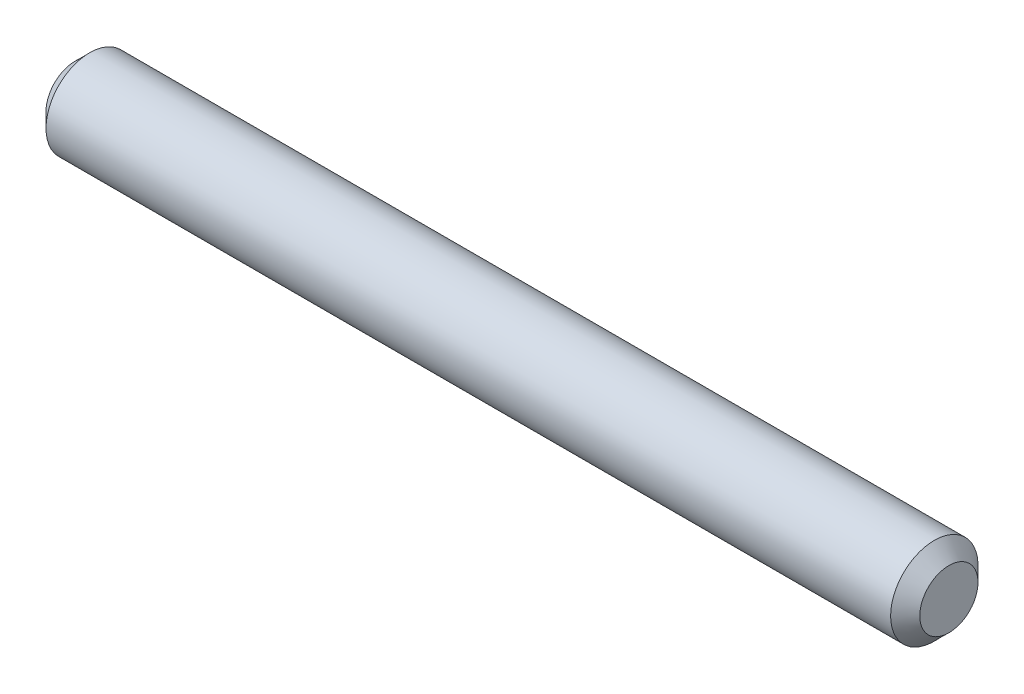
ISO-10303-21;
HEADER;
FILE_DESCRIPTION(('STEP AP214'),'2;1');
FILE_NAME('part.step','',(''),(''),'','','');
FILE_SCHEMA(('AUTOMOTIVE_DESIGN { 1 0 10303 214 1 1 1 1 }'));
ENDSEC;
DATA;
#1=APPLICATION_CONTEXT('core data for automotive mechanical design processes');
#2=APPLICATION_PROTOCOL_DEFINITION('international standard','automotive_design',2000,#1);
#3=PRODUCT_CONTEXT('',#1,'mechanical');
#4=PRODUCT('Part','Part','',(#3));
#5=PRODUCT_RELATED_PRODUCT_CATEGORY('part','',(#4));
#6=PRODUCT_DEFINITION_FORMATION('','',#4);
#7=PRODUCT_DEFINITION_CONTEXT('part definition',#1,'design');
#8=PRODUCT_DEFINITION('design','',#6,#7);
#9=PRODUCT_DEFINITION_SHAPE('','',#8);
#10=(LENGTH_UNIT() NAMED_UNIT(*) SI_UNIT(.MILLI.,.METRE.));
#11=(NAMED_UNIT(*) PLANE_ANGLE_UNIT() SI_UNIT($,.RADIAN.));
#12=(NAMED_UNIT(*) SI_UNIT($,.STERADIAN.) SOLID_ANGLE_UNIT());
#13=UNCERTAINTY_MEASURE_WITH_UNIT(LENGTH_MEASURE(1.E-05),#10,'distance_accuracy_value','');
#14=(GEOMETRIC_REPRESENTATION_CONTEXT(3) GLOBAL_UNCERTAINTY_ASSIGNED_CONTEXT((#13)) GLOBAL_UNIT_ASSIGNED_CONTEXT((#10,
#11,#12)) REPRESENTATION_CONTEXT('',''));
#15=CARTESIAN_POINT('',(0.,0.,0.));
#16=DIRECTION('',(0.,0.,1.));
#17=DIRECTION('',(1.,0.,0.));
#18=AXIS2_PLACEMENT_3D('',#15,#16,#17);
#19=CARTESIAN_POINT('',(1.5,0.,0.));
#20=DIRECTION('',(1.,0.,0.));
#21=DIRECTION('',(0.,0.,-1.));
#22=AXIS2_PLACEMENT_3D('',#19,#20,#21);
#23=PLANE('',#22);
#24=CARTESIAN_POINT('',(1.5,0.,0.));
#25=DIRECTION('',(-1.,0.,0.));
#26=DIRECTION('',(0.,0.,1.));
#27=AXIS2_PLACEMENT_3D('',#24,#25,#26);
#28=CIRCLE('',#27,1.);
#29=CARTESIAN_POINT('',(1.5,0.,1.));
#30=VERTEX_POINT('',#29);
#31=EDGE_CURVE('E10',#30,#30,#28,.T.);
#32=ORIENTED_EDGE('',*,*,#31,.T.);
#33=EDGE_LOOP('',(#32));
#34=FACE_BOUND('',#33,.T.);
#35=ADVANCED_FACE('F30',(#34),#23,.F.);
#36=CARTESIAN_POINT('',(2.,0.,0.));
#37=DIRECTION('',(1.,0.,0.));
#38=DIRECTION('',(0.,0.,-1.));
#39=AXIS2_PLACEMENT_3D('',#36,#37,#38);
#40=CONICAL_SURFACE('',#39,1.5,0.785398163397448);
#41=ORIENTED_EDGE('',*,*,#31,.F.);
#42=EDGE_LOOP('',(#41));
#43=FACE_BOUND('',#42,.T.);
#44=CARTESIAN_POINT('',(2.,0.,0.));
#45=DIRECTION('',(-1.,0.,0.));
#46=DIRECTION('',(0.,0.,1.));
#47=AXIS2_PLACEMENT_3D('',#44,#45,#46);
#48=CIRCLE('',#47,1.5);
#49=CARTESIAN_POINT('',(2.,0.,1.5));
#50=VERTEX_POINT('',#49);
#51=EDGE_CURVE('E36',#50,#50,#48,.T.);
#52=ORIENTED_EDGE('',*,*,#51,.T.);
#53=EDGE_LOOP('',(#52));
#54=FACE_BOUND('',#53,.T.);
#55=ADVANCED_FACE('F62',(#43,#54),#40,.T.);
#56=CARTESIAN_POINT('',(0.,0.,0.));
#57=DIRECTION('',(-1.,0.,0.));
#58=DIRECTION('',(0.,0.,1.));
#59=AXIS2_PLACEMENT_3D('',#56,#57,#58);
#60=CYLINDRICAL_SURFACE('',#59,1.5);
#61=ORIENTED_EDGE('',*,*,#51,.F.);
#62=EDGE_LOOP('',(#61));
#63=FACE_BOUND('',#62,.T.);
#64=CARTESIAN_POINT('',(31.,0.,0.));
#65=DIRECTION('',(-1.,0.,0.));
#66=DIRECTION('',(0.,0.,1.));
#67=AXIS2_PLACEMENT_3D('',#64,#65,#66);
#68=CIRCLE('',#67,1.5);
#69=CARTESIAN_POINT('',(31.,0.,1.5));
#70=VERTEX_POINT('',#69);
#71=EDGE_CURVE('E40',#70,#70,#68,.T.);
#72=ORIENTED_EDGE('',*,*,#71,.T.);
#73=EDGE_LOOP('',(#72));
#74=FACE_BOUND('',#73,.T.);
#75=ADVANCED_FACE('F58',(#63,#74),#60,.T.);
#76=CARTESIAN_POINT('',(31.5,0.,0.));
#77=DIRECTION('',(-1.,0.,0.));
#78=DIRECTION('',(0.,0.,1.));
#79=AXIS2_PLACEMENT_3D('',#76,#77,#78);
#80=CONICAL_SURFACE('',#79,1.,0.785398163397448);
#81=ORIENTED_EDGE('',*,*,#71,.F.);
#82=EDGE_LOOP('',(#81));
#83=FACE_BOUND('',#82,.T.);
#84=CARTESIAN_POINT('',(31.5,0.,0.));
#85=DIRECTION('',(-1.,0.,0.));
#86=DIRECTION('',(0.,0.,1.));
#87=AXIS2_PLACEMENT_3D('',#84,#85,#86);
#88=CIRCLE('',#87,1.);
#89=CARTESIAN_POINT('',(31.5,0.,1.));
#90=VERTEX_POINT('',#89);
#91=EDGE_CURVE('E44',#90,#90,#88,.T.);
#92=ORIENTED_EDGE('',*,*,#91,.T.);
#93=EDGE_LOOP('',(#92));
#94=FACE_BOUND('',#93,.T.);
#95=ADVANCED_FACE('F50',(#83,#94),#80,.T.);
#96=CARTESIAN_POINT('',(31.5,1.,0.));
#97=DIRECTION('',(-1.,0.,0.));
#98=DIRECTION('',(0.,0.,1.));
#99=AXIS2_PLACEMENT_3D('',#96,#97,#98);
#100=PLANE('',#99);
#101=ORIENTED_EDGE('',*,*,#91,.F.);
#102=EDGE_LOOP('',(#101));
#103=FACE_BOUND('',#102,.T.);
#104=ADVANCED_FACE('F52',(#103),#100,.F.);
#105=CLOSED_SHELL('',(#35,#55,#75,#95,#104));
#106=MANIFOLD_SOLID_BREP('B2',#105);
#107=ADVANCED_BREP_SHAPE_REPRESENTATION('',(#18,#106),#14);
#108=SHAPE_DEFINITION_REPRESENTATION(#9,#107);
ENDSEC;
END-ISO-10303-21;
